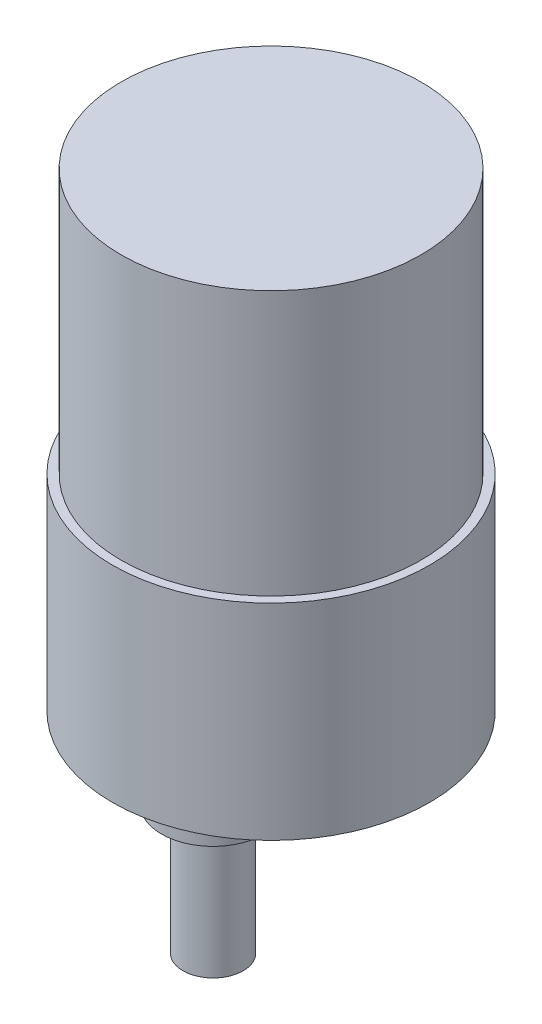
ISO-10303-21;
HEADER;
FILE_DESCRIPTION(('STEP AP214'),'2;1');
FILE_NAME('part.step','',(''),(''),'','','');
FILE_SCHEMA(('AUTOMOTIVE_DESIGN { 1 0 10303 214 1 1 1 1 }'));
ENDSEC;
DATA;
#1=APPLICATION_CONTEXT('core data for automotive mechanical design processes');
#2=APPLICATION_PROTOCOL_DEFINITION('international standard','automotive_design',2000,#1);
#3=PRODUCT_CONTEXT('',#1,'mechanical');
#4=PRODUCT('Part','Part','',(#3));
#5=PRODUCT_RELATED_PRODUCT_CATEGORY('part','',(#4));
#6=PRODUCT_DEFINITION_FORMATION('','',#4);
#7=PRODUCT_DEFINITION_CONTEXT('part definition',#1,'design');
#8=PRODUCT_DEFINITION('design','',#6,#7);
#9=PRODUCT_DEFINITION_SHAPE('','',#8);
#10=(LENGTH_UNIT() NAMED_UNIT(*) SI_UNIT(.MILLI.,.METRE.));
#11=(NAMED_UNIT(*) PLANE_ANGLE_UNIT() SI_UNIT($,.RADIAN.));
#12=(NAMED_UNIT(*) SI_UNIT($,.STERADIAN.) SOLID_ANGLE_UNIT());
#13=UNCERTAINTY_MEASURE_WITH_UNIT(LENGTH_MEASURE(1.E-05),#10,'distance_accuracy_value','');
#14=(GEOMETRIC_REPRESENTATION_CONTEXT(3) GLOBAL_UNCERTAINTY_ASSIGNED_CONTEXT((#13)) GLOBAL_UNIT_ASSIGNED_CONTEXT((#10,
#11,#12)) REPRESENTATION_CONTEXT('',''));
#15=CARTESIAN_POINT('',(0.,0.,0.));
#16=DIRECTION('',(0.,0.,1.));
#17=DIRECTION('',(1.,0.,0.));
#18=AXIS2_PLACEMENT_3D('',#15,#16,#17);
#19=CARTESIAN_POINT('',(0.,-54.56,0.));
#20=DIRECTION('',(0.,1.,0.));
#21=DIRECTION('',(0.,0.,1.));
#22=AXIS2_PLACEMENT_3D('',#19,#20,#21);
#23=CYLINDRICAL_SURFACE('',#22,18.4);
#24=CARTESIAN_POINT('',(0.,-54.56,0.));
#25=DIRECTION('',(0.,1.,0.));
#26=DIRECTION('',(0.,0.,1.));
#27=AXIS2_PLACEMENT_3D('',#24,#25,#26);
#28=CIRCLE('',#27,18.4);
#29=CARTESIAN_POINT('',(0.,-54.56,18.4));
#30=VERTEX_POINT('',#29);
#31=EDGE_CURVE('E87',#30,#30,#28,.T.);
#32=ORIENTED_EDGE('',*,*,#31,.T.);
#33=EDGE_LOOP('',(#32));
#34=FACE_BOUND('',#33,.T.);
#35=CARTESIAN_POINT('',(0.,-30.7,0.));
#36=DIRECTION('',(0.,1.,0.));
#37=DIRECTION('',(0.,0.,1.));
#38=AXIS2_PLACEMENT_3D('',#35,#36,#37);
#39=CIRCLE('',#38,18.4);
#40=CARTESIAN_POINT('',(0.,-30.7,18.4));
#41=VERTEX_POINT('',#40);
#42=EDGE_CURVE('E42',#41,#41,#39,.F.);
#43=ORIENTED_EDGE('',*,*,#42,.T.);
#44=EDGE_LOOP('',(#43));
#45=FACE_BOUND('',#44,.T.);
#46=ADVANCED_FACE('F39',(#34,#45),#23,.T.);
#47=CARTESIAN_POINT('',(0.,-54.56,0.));
#48=DIRECTION('',(0.,1.,0.));
#49=DIRECTION('',(0.,0.,1.));
#50=AXIS2_PLACEMENT_3D('',#47,#48,#49);
#51=PLANE('',#50);
#52=CARTESIAN_POINT('',(0.,-54.56,6.73));
#53=DIRECTION('',(0.,1.,0.));
#54=DIRECTION('',(0.,0.,1.));
#55=AXIS2_PLACEMENT_3D('',#52,#53,#54);
#56=CIRCLE('',#55,6.);
#57=CARTESIAN_POINT('',(0.,-54.56,12.73));
#58=VERTEX_POINT('',#57);
#59=EDGE_CURVE('E92',#58,#58,#56,.F.);
#60=ORIENTED_EDGE('',*,*,#59,.F.);
#61=EDGE_LOOP('',(#60));
#62=FACE_BOUND('',#61,.T.);
#63=ORIENTED_EDGE('',*,*,#31,.F.);
#64=EDGE_LOOP('',(#63));
#65=FACE_BOUND('',#64,.T.);
#66=ADVANCED_FACE('F102',(#62,#65),#51,.F.);
#67=CARTESIAN_POINT('',(0.,-60.56,6.73));
#68=DIRECTION('',(0.,1.,0.));
#69=DIRECTION('',(0.,0.,1.));
#70=AXIS2_PLACEMENT_3D('',#67,#68,#69);
#71=CYLINDRICAL_SURFACE('',#70,6.);
#72=CARTESIAN_POINT('',(0.,-60.56,6.73));
#73=DIRECTION('',(0.,-1.,0.));
#74=DIRECTION('',(0.,0.,-1.));
#75=AXIS2_PLACEMENT_3D('',#72,#73,#74);
#76=CIRCLE('',#75,6.);
#77=CARTESIAN_POINT('',(0.,-60.56,0.73));
#78=VERTEX_POINT('',#77);
#79=EDGE_CURVE('E83',#78,#78,#76,.T.);
#80=ORIENTED_EDGE('',*,*,#79,.F.);
#81=EDGE_LOOP('',(#80));
#82=FACE_BOUND('',#81,.T.);
#83=ORIENTED_EDGE('',*,*,#59,.T.);
#84=EDGE_LOOP('',(#83));
#85=FACE_BOUND('',#84,.T.);
#86=ADVANCED_FACE('F100',(#82,#85),#71,.T.);
#87=CARTESIAN_POINT('',(0.,-60.56,6.73));
#88=DIRECTION('',(0.,-1.,0.));
#89=DIRECTION('',(0.,0.,-1.));
#90=AXIS2_PLACEMENT_3D('',#87,#88,#89);
#91=PLANE('',#90);
#92=CARTESIAN_POINT('',(0.,-60.56,6.73));
#93=DIRECTION('',(0.,-1.,0.));
#94=DIRECTION('',(0.,0.,-1.));
#95=AXIS2_PLACEMENT_3D('',#92,#93,#94);
#96=CIRCLE('',#95,3.5);
#97=CARTESIAN_POINT('',(2.44948974278318,-60.56,4.23));
#98=VERTEX_POINT('',#97);
#99=CARTESIAN_POINT('',(-2.44948974278318,-60.56,4.23));
#100=VERTEX_POINT('',#99);
#101=EDGE_CURVE('E48',#98,#100,#96,.T.);
#102=ORIENTED_EDGE('',*,*,#101,.F.);
#103=DIRECTION('',(-1.,0.,0.));
#104=VECTOR('',#103,1.);
#105=CARTESIAN_POINT('',(-2.44948974278318,-60.56,4.23));
#106=LINE('',#105,#104);
#107=EDGE_CURVE('E72',#98,#100,#106,.T.);
#108=ORIENTED_EDGE('',*,*,#107,.T.);
#109=EDGE_LOOP('',(#102,#108));
#110=FACE_BOUND('',#109,.T.);
#111=ORIENTED_EDGE('',*,*,#79,.T.);
#112=EDGE_LOOP('',(#111));
#113=FACE_BOUND('',#112,.T.);
#114=ADVANCED_FACE('F123',(#110,#113),#91,.T.);
#115=CARTESIAN_POINT('',(0.,-75.56,6.73));
#116=DIRECTION('',(0.,1.,0.));
#117=DIRECTION('',(0.,0.,1.));
#118=AXIS2_PLACEMENT_3D('',#115,#116,#117);
#119=CYLINDRICAL_SURFACE('',#118,3.5);
#120=CARTESIAN_POINT('',(0.,-75.56,6.73));
#121=DIRECTION('',(0.,-1.,0.));
#122=DIRECTION('',(0.,0.,-1.));
#123=AXIS2_PLACEMENT_3D('',#120,#121,#122);
#124=CIRCLE('',#123,3.5);
#125=CARTESIAN_POINT('',(2.44948974278318,-75.56,4.23));
#126=VERTEX_POINT('',#125);
#127=CARTESIAN_POINT('',(-2.44948974278318,-75.56,4.23));
#128=VERTEX_POINT('',#127);
#129=EDGE_CURVE('E77',#126,#128,#124,.T.);
#130=ORIENTED_EDGE('',*,*,#129,.F.);
#131=DIRECTION('',(0.,-1.,0.));
#132=VECTOR('',#131,1.);
#133=CARTESIAN_POINT('',(2.44948974278318,-60.56,4.23));
#134=LINE('',#133,#132);
#135=EDGE_CURVE('E56',#98,#126,#134,.T.);
#136=ORIENTED_EDGE('',*,*,#135,.F.);
#137=ORIENTED_EDGE('',*,*,#101,.T.);
#138=DIRECTION('',(0.,-1.,0.));
#139=VECTOR('',#138,1.);
#140=CARTESIAN_POINT('',(-2.44948974278318,-60.56,4.23));
#141=LINE('',#140,#139);
#142=EDGE_CURVE('E62',#100,#128,#141,.T.);
#143=ORIENTED_EDGE('',*,*,#142,.T.);
#144=EDGE_LOOP('',(#130,#136,#137,#143));
#145=FACE_BOUND('',#144,.T.);
#146=ADVANCED_FACE('F76',(#145),#119,.T.);
#147=CARTESIAN_POINT('',(0.,-75.56,6.73));
#148=DIRECTION('',(0.,-1.,0.));
#149=DIRECTION('',(0.,0.,-1.));
#150=AXIS2_PLACEMENT_3D('',#147,#148,#149);
#151=PLANE('',#150);
#152=DIRECTION('',(-1.,0.,0.));
#153=VECTOR('',#152,1.);
#154=CARTESIAN_POINT('',(-2.44948974278318,-75.56,4.23));
#155=LINE('',#154,#153);
#156=EDGE_CURVE('E66',#126,#128,#155,.T.);
#157=ORIENTED_EDGE('',*,*,#156,.F.);
#158=ORIENTED_EDGE('',*,*,#129,.T.);
#159=EDGE_LOOP('',(#157,#158));
#160=FACE_BOUND('',#159,.T.);
#161=ADVANCED_FACE('F81',(#160),#151,.T.);
#162=CARTESIAN_POINT('',(-2.44948974278318,-60.56,4.23));
#163=DIRECTION('',(0.,0.,1.));
#164=DIRECTION('',(1.,0.,0.));
#165=AXIS2_PLACEMENT_3D('',#162,#163,#164);
#166=PLANE('',#165);
#167=ORIENTED_EDGE('',*,*,#156,.T.);
#168=ORIENTED_EDGE('',*,*,#142,.F.);
#169=ORIENTED_EDGE('',*,*,#107,.F.);
#170=ORIENTED_EDGE('',*,*,#135,.T.);
#171=EDGE_LOOP('',(#167,#168,#169,#170));
#172=FACE_BOUND('',#171,.T.);
#173=ADVANCED_FACE('F67',(#172),#166,.F.);
#174=CARTESIAN_POINT('',(0.,-30.7,0.));
#175=DIRECTION('',(0.,1.,0.));
#176=DIRECTION('',(0.,0.,1.));
#177=AXIS2_PLACEMENT_3D('',#174,#175,#176);
#178=PLANE('',#177);
#179=CARTESIAN_POINT('',(0.,-30.7,0.));
#180=DIRECTION('',(0.,1.,0.));
#181=DIRECTION('',(0.,0.,1.));
#182=AXIS2_PLACEMENT_3D('',#179,#180,#181);
#183=CIRCLE('',#182,17.4);
#184=CARTESIAN_POINT('',(0.,-30.7,17.4));
#185=VERTEX_POINT('',#184);
#186=EDGE_CURVE('E11',#185,#185,#183,.T.);
#187=ORIENTED_EDGE('',*,*,#186,.F.);
#188=EDGE_LOOP('',(#187));
#189=FACE_BOUND('',#188,.T.);
#190=ORIENTED_EDGE('',*,*,#42,.F.);
#191=EDGE_LOOP('',(#190));
#192=FACE_BOUND('',#191,.T.);
#193=ADVANCED_FACE('F140',(#189,#192),#178,.T.);
#194=CARTESIAN_POINT('',(0.,0.,0.));
#195=DIRECTION('',(0.,-1.,0.));
#196=DIRECTION('',(0.,0.,-1.));
#197=AXIS2_PLACEMENT_3D('',#194,#195,#196);
#198=CYLINDRICAL_SURFACE('',#197,17.4);
#199=CARTESIAN_POINT('',(0.,0.,0.));
#200=DIRECTION('',(0.,1.,0.));
#201=DIRECTION('',(0.,0.,1.));
#202=AXIS2_PLACEMENT_3D('',#199,#200,#201);
#203=CIRCLE('',#202,17.4);
#204=CARTESIAN_POINT('',(0.,0.,17.4));
#205=VERTEX_POINT('',#204);
#206=EDGE_CURVE('E113',#205,#205,#203,.T.);
#207=ORIENTED_EDGE('',*,*,#206,.F.);
#208=EDGE_LOOP('',(#207));
#209=FACE_BOUND('',#208,.T.);
#210=ORIENTED_EDGE('',*,*,#186,.T.);
#211=EDGE_LOOP('',(#210));
#212=FACE_BOUND('',#211,.T.);
#213=ADVANCED_FACE('F143',(#209,#212),#198,.T.);
#214=CARTESIAN_POINT('',(0.,0.,0.));
#215=DIRECTION('',(0.,1.,0.));
#216=DIRECTION('',(0.,0.,1.));
#217=AXIS2_PLACEMENT_3D('',#214,#215,#216);
#218=PLANE('',#217);
#219=ORIENTED_EDGE('',*,*,#206,.T.);
#220=EDGE_LOOP('',(#219));
#221=FACE_BOUND('',#220,.T.);
#222=ADVANCED_FACE('F147',(#221),#218,.T.);
#223=CLOSED_SHELL('',(#46,#66,#86,#114,#146,#161,#173,#193,#213,#222));
#224=MANIFOLD_SOLID_BREP('B2',#223);
#225=ADVANCED_BREP_SHAPE_REPRESENTATION('',(#18,#224),#14);
#226=SHAPE_DEFINITION_REPRESENTATION(#9,#225);
ENDSEC;
END-ISO-10303-21;
